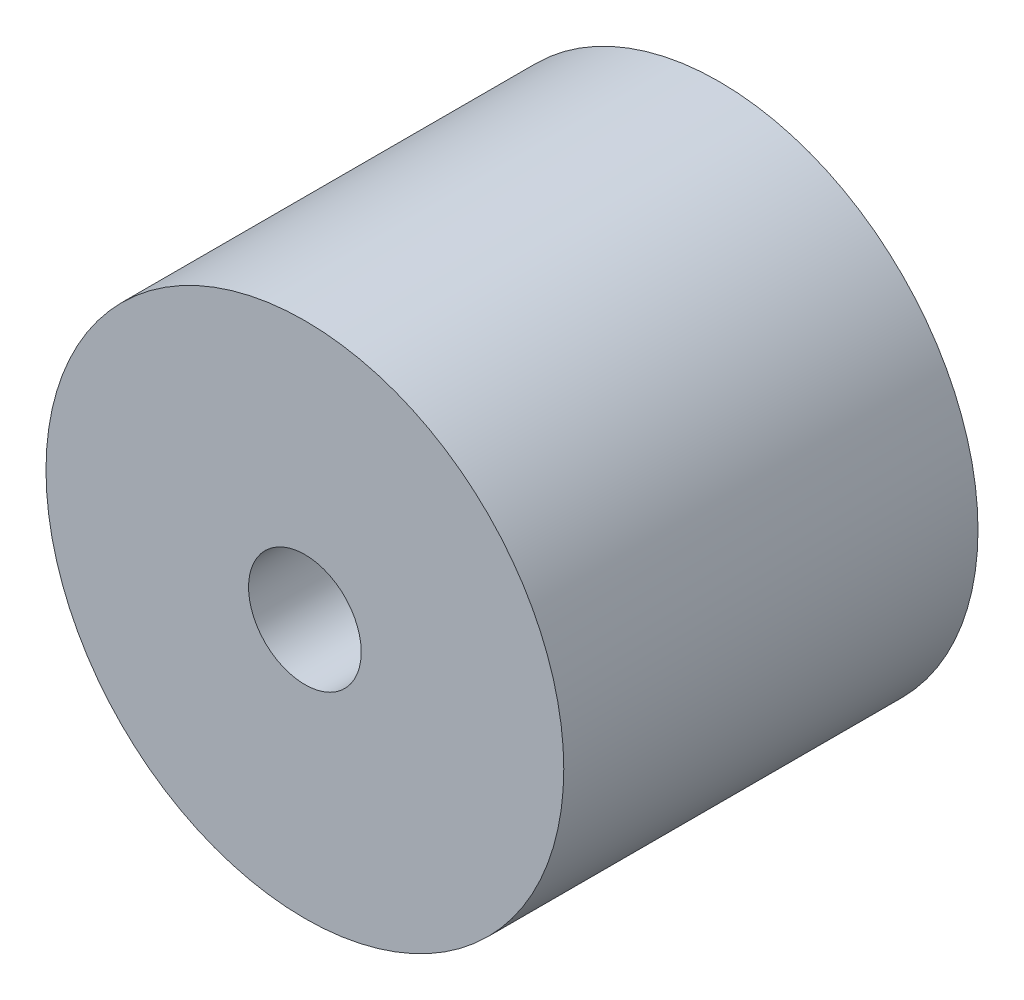
ISO-10303-21;
HEADER;
FILE_DESCRIPTION(('STEP AP214'),'2;1');
FILE_NAME('part.step','',(''),(''),'','','');
FILE_SCHEMA(('AUTOMOTIVE_DESIGN { 1 0 10303 214 1 1 1 1 }'));
ENDSEC;
DATA;
#1=APPLICATION_CONTEXT('core data for automotive mechanical design processes');
#2=APPLICATION_PROTOCOL_DEFINITION('international standard','automotive_design',2000,#1);
#3=PRODUCT_CONTEXT('',#1,'mechanical');
#4=PRODUCT('Part','Part','',(#3));
#5=PRODUCT_RELATED_PRODUCT_CATEGORY('part','',(#4));
#6=PRODUCT_DEFINITION_FORMATION('','',#4);
#7=PRODUCT_DEFINITION_CONTEXT('part definition',#1,'design');
#8=PRODUCT_DEFINITION('design','',#6,#7);
#9=PRODUCT_DEFINITION_SHAPE('','',#8);
#10=(LENGTH_UNIT() NAMED_UNIT(*) SI_UNIT(.MILLI.,.METRE.));
#11=(NAMED_UNIT(*) PLANE_ANGLE_UNIT() SI_UNIT($,.RADIAN.));
#12=(NAMED_UNIT(*) SI_UNIT($,.STERADIAN.) SOLID_ANGLE_UNIT());
#13=UNCERTAINTY_MEASURE_WITH_UNIT(LENGTH_MEASURE(1.E-05),#10,'distance_accuracy_value','');
#14=(GEOMETRIC_REPRESENTATION_CONTEXT(3) GLOBAL_UNCERTAINTY_ASSIGNED_CONTEXT((#13)) GLOBAL_UNIT_ASSIGNED_CONTEXT((#10,
#11,#12)) REPRESENTATION_CONTEXT('',''));
#15=CARTESIAN_POINT('',(0.,0.,0.));
#16=DIRECTION('',(0.,0.,1.));
#17=DIRECTION('',(1.,0.,0.));
#18=AXIS2_PLACEMENT_3D('',#15,#16,#17);
#19=CARTESIAN_POINT('',(0.,0.,12.7));
#20=DIRECTION('',(0.,0.,-1.));
#21=DIRECTION('',(-1.,0.,0.));
#22=AXIS2_PLACEMENT_3D('',#19,#20,#21);
#23=CYLINDRICAL_SURFACE('',#22,7.9375);
#24=CARTESIAN_POINT('',(0.,0.,12.7));
#25=DIRECTION('',(0.,0.,1.));
#26=DIRECTION('',(1.,0.,0.));
#27=AXIS2_PLACEMENT_3D('',#24,#25,#26);
#28=CIRCLE('',#27,7.9375);
#29=CARTESIAN_POINT('',(7.9375,0.,12.7));
#30=VERTEX_POINT('',#29);
#31=EDGE_CURVE('E10',#30,#30,#28,.T.);
#32=ORIENTED_EDGE('',*,*,#31,.F.);
#33=EDGE_LOOP('',(#32));
#34=FACE_BOUND('',#33,.T.);
#35=CARTESIAN_POINT('',(0.,0.,0.));
#36=DIRECTION('',(0.,0.,1.));
#37=DIRECTION('',(1.,0.,0.));
#38=AXIS2_PLACEMENT_3D('',#35,#36,#37);
#39=CIRCLE('',#38,7.9375);
#40=CARTESIAN_POINT('',(7.9375,0.,0.));
#41=VERTEX_POINT('',#40);
#42=EDGE_CURVE('E35',#41,#41,#39,.T.);
#43=ORIENTED_EDGE('',*,*,#42,.T.);
#44=EDGE_LOOP('',(#43));
#45=FACE_BOUND('',#44,.T.);
#46=ADVANCED_FACE('F32',(#34,#45),#23,.T.);
#47=CARTESIAN_POINT('',(0.,0.,12.7));
#48=DIRECTION('',(0.,0.,1.));
#49=DIRECTION('',(1.,0.,0.));
#50=AXIS2_PLACEMENT_3D('',#47,#48,#49);
#51=PLANE('',#50);
#52=CARTESIAN_POINT('',(0.,0.,12.7));
#53=DIRECTION('',(0.,0.,1.));
#54=DIRECTION('',(1.,0.,0.));
#55=AXIS2_PLACEMENT_3D('',#52,#53,#54);
#56=CIRCLE('',#55,1.72719999999999);
#57=CARTESIAN_POINT('',(1.72719999999999,0.,12.7));
#58=VERTEX_POINT('',#57);
#59=EDGE_CURVE('E46',#58,#58,#56,.T.);
#60=ORIENTED_EDGE('',*,*,#59,.F.);
#61=EDGE_LOOP('',(#60));
#62=FACE_BOUND('',#61,.T.);
#63=ORIENTED_EDGE('',*,*,#31,.T.);
#64=EDGE_LOOP('',(#63));
#65=FACE_BOUND('',#64,.T.);
#66=ADVANCED_FACE('F52',(#62,#65),#51,.T.);
#67=CARTESIAN_POINT('',(0.,0.,0.));
#68=DIRECTION('',(0.,0.,1.));
#69=DIRECTION('',(1.,0.,0.));
#70=AXIS2_PLACEMENT_3D('',#67,#68,#69);
#71=PLANE('',#70);
#72=CARTESIAN_POINT('',(0.,0.,0.));
#73=DIRECTION('',(0.,0.,1.));
#74=DIRECTION('',(1.,0.,0.));
#75=AXIS2_PLACEMENT_3D('',#72,#73,#74);
#76=CIRCLE('',#75,1.7272);
#77=CARTESIAN_POINT('',(1.7272,0.,0.));
#78=VERTEX_POINT('',#77);
#79=EDGE_CURVE('E42',#78,#78,#76,.T.);
#80=ORIENTED_EDGE('',*,*,#79,.T.);
#81=EDGE_LOOP('',(#80));
#82=FACE_BOUND('',#81,.T.);
#83=ORIENTED_EDGE('',*,*,#42,.F.);
#84=EDGE_LOOP('',(#83));
#85=FACE_BOUND('',#84,.T.);
#86=ADVANCED_FACE('F54',(#82,#85),#71,.F.);
#87=CARTESIAN_POINT('',(0.,0.,12.7));
#88=DIRECTION('',(0.,0.,1.));
#89=DIRECTION('',(1.,0.,0.));
#90=AXIS2_PLACEMENT_3D('',#87,#88,#89);
#91=CYLINDRICAL_SURFACE('',#90,1.72719999999999);
#92=ORIENTED_EDGE('',*,*,#79,.F.);
#93=EDGE_LOOP('',(#92));
#94=FACE_BOUND('',#93,.T.);
#95=ORIENTED_EDGE('',*,*,#59,.T.);
#96=EDGE_LOOP('',(#95));
#97=FACE_BOUND('',#96,.T.);
#98=ADVANCED_FACE('F50',(#94,#97),#91,.F.);
#99=CLOSED_SHELL('',(#46,#66,#86,#98));
#100=MANIFOLD_SOLID_BREP('B2',#99);
#101=ADVANCED_BREP_SHAPE_REPRESENTATION('',(#18,#100),#14);
#102=SHAPE_DEFINITION_REPRESENTATION(#9,#101);
ENDSEC;
END-ISO-10303-21;
